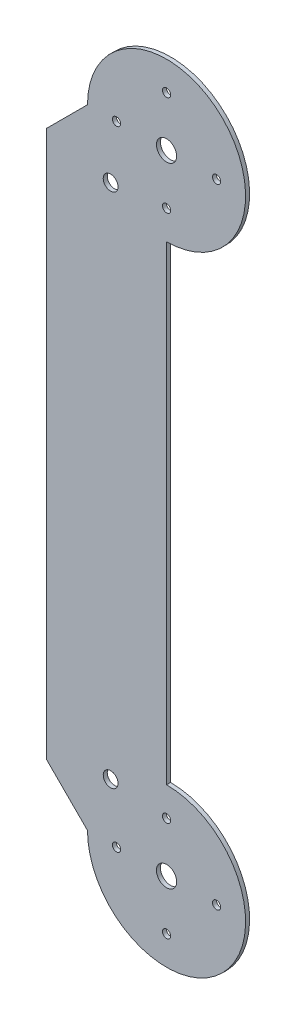
ISO-10303-21;
HEADER;
FILE_DESCRIPTION(('STEP AP214'),'2;1');
FILE_NAME('part.step','',(''),(''),'','','');
FILE_SCHEMA(('AUTOMOTIVE_DESIGN { 1 0 10303 214 1 1 1 1 }'));
ENDSEC;
DATA;
#1=APPLICATION_CONTEXT('core data for automotive mechanical design processes');
#2=APPLICATION_PROTOCOL_DEFINITION('international standard','automotive_design',2000,#1);
#3=PRODUCT_CONTEXT('',#1,'mechanical');
#4=PRODUCT('Part','Part','',(#3));
#5=PRODUCT_RELATED_PRODUCT_CATEGORY('part','',(#4));
#6=PRODUCT_DEFINITION_FORMATION('','',#4);
#7=PRODUCT_DEFINITION_CONTEXT('part definition',#1,'design');
#8=PRODUCT_DEFINITION('design','',#6,#7);
#9=PRODUCT_DEFINITION_SHAPE('','',#8);
#10=(LENGTH_UNIT() NAMED_UNIT(*) SI_UNIT(.MILLI.,.METRE.));
#11=(NAMED_UNIT(*) PLANE_ANGLE_UNIT() SI_UNIT($,.RADIAN.));
#12=(NAMED_UNIT(*) SI_UNIT($,.STERADIAN.) SOLID_ANGLE_UNIT());
#13=UNCERTAINTY_MEASURE_WITH_UNIT(LENGTH_MEASURE(1.E-05),#10,'distance_accuracy_value','');
#14=(GEOMETRIC_REPRESENTATION_CONTEXT(3) GLOBAL_UNCERTAINTY_ASSIGNED_CONTEXT((#13)) GLOBAL_UNIT_ASSIGNED_CONTEXT((#10,
#11,#12)) REPRESENTATION_CONTEXT('',''));
#15=CARTESIAN_POINT('',(0.,0.,0.));
#16=DIRECTION('',(0.,0.,1.));
#17=DIRECTION('',(1.,0.,0.));
#18=AXIS2_PLACEMENT_3D('',#15,#16,#17);
#19=CARTESIAN_POINT('',(-80.6879910513364,81.9149429056732,2.));
#20=DIRECTION('',(0.,0.,-1.));
#21=DIRECTION('',(-1.,0.,0.));
#22=AXIS2_PLACEMENT_3D('',#19,#20,#21);
#23=PLANE('',#22);
#24=CARTESIAN_POINT('',(-80.6879910513364,81.9149429056732,2.));
#25=DIRECTION('',(0.,0.,1.));
#26=DIRECTION('',(-1.,0.,0.));
#27=AXIS2_PLACEMENT_3D('',#24,#25,#26);
#28=CIRCLE('',#27,39.5);
#29=CARTESIAN_POINT('',(-80.6879910513364,42.4149429056732,2.));
#30=VERTEX_POINT('',#29);
#31=CARTESIAN_POINT('',(-120.187991051336,81.9149429056732,2.));
#32=VERTEX_POINT('',#31);
#33=EDGE_CURVE('E146',#30,#32,#28,.T.);
#34=ORIENTED_EDGE('',*,*,#33,.T.);
#35=DIRECTION('',(-0.707106781186552,-0.707106781186543,0.));
#36=VECTOR('',#35,1.);
#37=CARTESIAN_POINT('',(-120.187991051336,81.9149429056732,2.));
#38=LINE('',#37,#36);
#39=CARTESIAN_POINT('',(-140.687991051336,61.4149429056735,2.));
#40=VERTEX_POINT('',#39);
#41=EDGE_CURVE('E94',#32,#40,#38,.T.);
#42=ORIENTED_EDGE('',*,*,#41,.T.);
#43=DIRECTION('',(0.,-1.,0.));
#44=VECTOR('',#43,1.);
#45=CARTESIAN_POINT('',(-140.687991051336,-211.585057094327,2.));
#46=LINE('',#45,#44);
#47=CARTESIAN_POINT('',(-140.687991051336,-211.585057094327,2.));
#48=VERTEX_POINT('',#47);
#49=EDGE_CURVE('E107',#40,#48,#46,.T.);
#50=ORIENTED_EDGE('',*,*,#49,.T.);
#51=DIRECTION('',(0.707106781186552,-0.707106781186543,0.));
#52=VECTOR('',#51,1.);
#53=CARTESIAN_POINT('',(-120.187991051336,-232.085057094327,2.));
#54=LINE('',#53,#52);
#55=CARTESIAN_POINT('',(-120.187991051336,-232.085057094327,2.));
#56=VERTEX_POINT('',#55);
#57=EDGE_CURVE('E101',#48,#56,#54,.T.);
#58=ORIENTED_EDGE('',*,*,#57,.T.);
#59=CARTESIAN_POINT('',(-80.6879910513363,-232.085057094327,2.));
#60=DIRECTION('',(0.,0.,1.));
#61=DIRECTION('',(1.,0.,0.));
#62=AXIS2_PLACEMENT_3D('',#59,#60,#61);
#63=CIRCLE('',#62,39.5);
#64=CARTESIAN_POINT('',(-80.6879910513363,-192.585057094327,2.));
#65=VERTEX_POINT('',#64);
#66=EDGE_CURVE('E105',#56,#65,#63,.T.);
#67=ORIENTED_EDGE('',*,*,#66,.T.);
#68=DIRECTION('',(0.,1.,0.));
#69=VECTOR('',#68,1.);
#70=CARTESIAN_POINT('',(-80.6879910513364,42.4149429056732,2.));
#71=LINE('',#70,#69);
#72=EDGE_CURVE('E57',#65,#30,#71,.T.);
#73=ORIENTED_EDGE('',*,*,#72,.T.);
#74=EDGE_LOOP('',(#34,#42,#50,#58,#67,#73));
#75=FACE_BOUND('',#74,.T.);
#76=CARTESIAN_POINT('',(-80.6879910513364,56.9149429056733,2.));
#77=DIRECTION('',(0.,0.,1.));
#78=DIRECTION('',(1.,0.,0.));
#79=AXIS2_PLACEMENT_3D('',#76,#77,#78);
#80=CIRCLE('',#79,2.04999999999999);
#81=CARTESIAN_POINT('',(-78.6379910513364,56.9149429056733,2.));
#82=VERTEX_POINT('',#81);
#83=EDGE_CURVE('E134',#82,#82,#80,.T.);
#84=ORIENTED_EDGE('',*,*,#83,.F.);
#85=EDGE_LOOP('',(#84));
#86=FACE_BOUND('',#85,.T.);
#87=CARTESIAN_POINT('',(-105.687991051336,81.9149429056733,2.));
#88=DIRECTION('',(0.,0.,1.));
#89=DIRECTION('',(1.,0.,0.));
#90=AXIS2_PLACEMENT_3D('',#87,#88,#89);
#91=CIRCLE('',#90,2.04999999999998);
#92=CARTESIAN_POINT('',(-103.637991051336,81.9149429056733,2.));
#93=VERTEX_POINT('',#92);
#94=EDGE_CURVE('E314',#93,#93,#91,.T.);
#95=ORIENTED_EDGE('',*,*,#94,.F.);
#96=EDGE_LOOP('',(#95));
#97=FACE_BOUND('',#96,.T.);
#98=CARTESIAN_POINT('',(-80.6879910513364,106.914942905673,2.));
#99=DIRECTION('',(0.,0.,1.));
#100=DIRECTION('',(1.,0.,0.));
#101=AXIS2_PLACEMENT_3D('',#98,#99,#100);
#102=CIRCLE('',#101,2.04999999999998);
#103=CARTESIAN_POINT('',(-78.6379910513364,106.914942905673,2.));
#104=VERTEX_POINT('',#103);
#105=EDGE_CURVE('E306',#104,#104,#102,.T.);
#106=ORIENTED_EDGE('',*,*,#105,.F.);
#107=EDGE_LOOP('',(#106));
#108=FACE_BOUND('',#107,.T.);
#109=CARTESIAN_POINT('',(-108.618708908205,53.9842250488048,2.));
#110=DIRECTION('',(0.,0.,1.));
#111=DIRECTION('',(1.,0.,0.));
#112=AXIS2_PLACEMENT_3D('',#109,#110,#111);
#113=CIRCLE('',#112,3.70173268789992);
#114=CARTESIAN_POINT('',(-104.916976220305,53.9842250488048,2.));
#115=VERTEX_POINT('',#114);
#116=EDGE_CURVE('E298',#115,#115,#113,.T.);
#117=ORIENTED_EDGE('',*,*,#116,.F.);
#118=EDGE_LOOP('',(#117));
#119=FACE_BOUND('',#118,.T.);
#120=CARTESIAN_POINT('',(-55.6879910513364,81.9149429056732,2.));
#121=DIRECTION('',(0.,0.,1.));
#122=DIRECTION('',(1.,0.,0.));
#123=AXIS2_PLACEMENT_3D('',#120,#121,#122);
#124=CIRCLE('',#123,2.04999999999999);
#125=CARTESIAN_POINT('',(-53.6379910513364,81.9149429056732,2.));
#126=VERTEX_POINT('',#125);
#127=EDGE_CURVE('E290',#126,#126,#124,.T.);
#128=ORIENTED_EDGE('',*,*,#127,.F.);
#129=EDGE_LOOP('',(#128));
#130=FACE_BOUND('',#129,.T.);
#131=CARTESIAN_POINT('',(-80.6879910513363,-257.085057094327,2.));
#132=DIRECTION('',(0.,0.,1.));
#133=DIRECTION('',(-1.,0.,0.));
#134=AXIS2_PLACEMENT_3D('',#131,#132,#133);
#135=CIRCLE('',#134,2.05000000000002);
#136=CARTESIAN_POINT('',(-82.7379910513363,-257.085057094327,2.));
#137=VERTEX_POINT('',#136);
#138=EDGE_CURVE('E282',#137,#137,#135,.T.);
#139=ORIENTED_EDGE('',*,*,#138,.F.);
#140=EDGE_LOOP('',(#139));
#141=FACE_BOUND('',#140,.T.);
#142=CARTESIAN_POINT('',(-105.687991051336,-232.085057094327,2.));
#143=DIRECTION('',(0.,0.,1.));
#144=DIRECTION('',(-1.,0.,0.));
#145=AXIS2_PLACEMENT_3D('',#142,#143,#144);
#146=CIRCLE('',#145,2.05);
#147=CARTESIAN_POINT('',(-107.737991051336,-232.085057094327,2.));
#148=VERTEX_POINT('',#147);
#149=EDGE_CURVE('E274',#148,#148,#146,.T.);
#150=ORIENTED_EDGE('',*,*,#149,.F.);
#151=EDGE_LOOP('',(#150));
#152=FACE_BOUND('',#151,.T.);
#153=CARTESIAN_POINT('',(-55.6879910513363,-232.085057094327,2.));
#154=DIRECTION('',(0.,0.,1.));
#155=DIRECTION('',(-1.,0.,0.));
#156=AXIS2_PLACEMENT_3D('',#153,#154,#155);
#157=CIRCLE('',#156,2.04999999999999);
#158=CARTESIAN_POINT('',(-57.7379910513363,-232.085057094327,2.));
#159=VERTEX_POINT('',#158);
#160=EDGE_CURVE('E266',#159,#159,#157,.T.);
#161=ORIENTED_EDGE('',*,*,#160,.F.);
#162=EDGE_LOOP('',(#161));
#163=FACE_BOUND('',#162,.T.);
#164=CARTESIAN_POINT('',(-108.618708908205,-204.154339237458,2.));
#165=DIRECTION('',(0.,0.,1.));
#166=DIRECTION('',(-1.,0.,0.));
#167=AXIS2_PLACEMENT_3D('',#164,#165,#166);
#168=CIRCLE('',#167,3.70173268789995);
#169=CARTESIAN_POINT('',(-112.320441596105,-204.154339237458,2.));
#170=VERTEX_POINT('',#169);
#171=EDGE_CURVE('E258',#170,#170,#168,.T.);
#172=ORIENTED_EDGE('',*,*,#171,.F.);
#173=EDGE_LOOP('',(#172));
#174=FACE_BOUND('',#173,.T.);
#175=CARTESIAN_POINT('',(-80.6879910513363,-207.085057094327,2.));
#176=DIRECTION('',(0.,0.,1.));
#177=DIRECTION('',(-1.,0.,0.));
#178=AXIS2_PLACEMENT_3D('',#175,#176,#177);
#179=CIRCLE('',#178,2.04999999999999);
#180=CARTESIAN_POINT('',(-82.7379910513363,-207.085057094327,2.));
#181=VERTEX_POINT('',#180);
#182=EDGE_CURVE('E250',#181,#181,#179,.T.);
#183=ORIENTED_EDGE('',*,*,#182,.F.);
#184=EDGE_LOOP('',(#183));
#185=FACE_BOUND('',#184,.T.);
#186=CARTESIAN_POINT('',(-80.6879910513363,-232.085057094327,2.));
#187=DIRECTION('',(0.,0.,1.));
#188=DIRECTION('',(-1.,0.,0.));
#189=AXIS2_PLACEMENT_3D('',#186,#187,#188);
#190=CIRCLE('',#189,5.04999999999994);
#191=CARTESIAN_POINT('',(-85.7379910513362,-232.085057094327,2.));
#192=VERTEX_POINT('',#191);
#193=EDGE_CURVE('E242',#192,#192,#190,.T.);
#194=ORIENTED_EDGE('',*,*,#193,.F.);
#195=EDGE_LOOP('',(#194));
#196=FACE_BOUND('',#195,.T.);
#197=CARTESIAN_POINT('',(-80.6879910513363,81.9149429056732,2.));
#198=DIRECTION('',(0.,0.,1.));
#199=DIRECTION('',(1.,0.,0.));
#200=AXIS2_PLACEMENT_3D('',#197,#198,#199);
#201=CIRCLE('',#200,5.04999999999996);
#202=CARTESIAN_POINT('',(-75.6379910513364,81.9149429056732,2.));
#203=VERTEX_POINT('',#202);
#204=EDGE_CURVE('E231',#203,#203,#201,.T.);
#205=ORIENTED_EDGE('',*,*,#204,.F.);
#206=EDGE_LOOP('',(#205));
#207=FACE_BOUND('',#206,.T.);
#208=ADVANCED_FACE('F39',(#75,#86,#97,#108,#119,#130,#141,#152,#163,#174,#185,#196,#207),#23,.F.);
#209=CARTESIAN_POINT('',(-80.6879910513364,81.9149429056732,0.));
#210=DIRECTION('',(0.,0.,-1.));
#211=DIRECTION('',(-1.,0.,0.));
#212=AXIS2_PLACEMENT_3D('',#209,#210,#211);
#213=PLANE('',#212);
#214=CARTESIAN_POINT('',(-80.6879910513363,-232.085057094327,0.));
#215=DIRECTION('',(0.,0.,1.));
#216=DIRECTION('',(-1.,0.,0.));
#217=AXIS2_PLACEMENT_3D('',#214,#215,#216);
#218=CIRCLE('',#217,5.04999999999994);
#219=CARTESIAN_POINT('',(-85.7379910513362,-232.085057094327,0.));
#220=VERTEX_POINT('',#219);
#221=EDGE_CURVE('E239',#220,#220,#218,.T.);
#222=ORIENTED_EDGE('',*,*,#221,.T.);
#223=EDGE_LOOP('',(#222));
#224=FACE_BOUND('',#223,.T.);
#225=CARTESIAN_POINT('',(-108.618708908205,-204.154339237458,0.));
#226=DIRECTION('',(0.,0.,1.));
#227=DIRECTION('',(-1.,0.,0.));
#228=AXIS2_PLACEMENT_3D('',#225,#226,#227);
#229=CIRCLE('',#228,3.70173268789995);
#230=CARTESIAN_POINT('',(-112.320441596105,-204.154339237458,0.));
#231=VERTEX_POINT('',#230);
#232=EDGE_CURVE('E254',#231,#231,#229,.T.);
#233=ORIENTED_EDGE('',*,*,#232,.T.);
#234=EDGE_LOOP('',(#233));
#235=FACE_BOUND('',#234,.T.);
#236=CARTESIAN_POINT('',(-105.687991051336,-232.085057094327,0.));
#237=DIRECTION('',(0.,0.,1.));
#238=DIRECTION('',(-1.,0.,0.));
#239=AXIS2_PLACEMENT_3D('',#236,#237,#238);
#240=CIRCLE('',#239,2.05);
#241=CARTESIAN_POINT('',(-107.737991051336,-232.085057094327,0.));
#242=VERTEX_POINT('',#241);
#243=EDGE_CURVE('E270',#242,#242,#240,.T.);
#244=ORIENTED_EDGE('',*,*,#243,.T.);
#245=EDGE_LOOP('',(#244));
#246=FACE_BOUND('',#245,.T.);
#247=CARTESIAN_POINT('',(-55.6879910513364,81.9149429056732,0.));
#248=DIRECTION('',(0.,0.,1.));
#249=DIRECTION('',(1.,0.,0.));
#250=AXIS2_PLACEMENT_3D('',#247,#248,#249);
#251=CIRCLE('',#250,2.04999999999999);
#252=CARTESIAN_POINT('',(-53.6379910513364,81.9149429056732,0.));
#253=VERTEX_POINT('',#252);
#254=EDGE_CURVE('E286',#253,#253,#251,.T.);
#255=ORIENTED_EDGE('',*,*,#254,.T.);
#256=EDGE_LOOP('',(#255));
#257=FACE_BOUND('',#256,.T.);
#258=CARTESIAN_POINT('',(-80.6879910513364,106.914942905673,0.));
#259=DIRECTION('',(0.,0.,1.));
#260=DIRECTION('',(1.,0.,0.));
#261=AXIS2_PLACEMENT_3D('',#258,#259,#260);
#262=CIRCLE('',#261,2.04999999999998);
#263=CARTESIAN_POINT('',(-78.6379910513364,106.914942905673,0.));
#264=VERTEX_POINT('',#263);
#265=EDGE_CURVE('E302',#264,#264,#262,.T.);
#266=ORIENTED_EDGE('',*,*,#265,.T.);
#267=EDGE_LOOP('',(#266));
#268=FACE_BOUND('',#267,.T.);
#269=CARTESIAN_POINT('',(-80.6879910513364,56.9149429056733,0.));
#270=DIRECTION('',(0.,0.,1.));
#271=DIRECTION('',(1.,0.,0.));
#272=AXIS2_PLACEMENT_3D('',#269,#270,#271);
#273=CIRCLE('',#272,2.04999999999999);
#274=CARTESIAN_POINT('',(-78.6379910513364,56.9149429056733,0.));
#275=VERTEX_POINT('',#274);
#276=EDGE_CURVE('E318',#275,#275,#273,.T.);
#277=ORIENTED_EDGE('',*,*,#276,.T.);
#278=EDGE_LOOP('',(#277));
#279=FACE_BOUND('',#278,.T.);
#280=CARTESIAN_POINT('',(-80.6879910513364,81.9149429056732,0.));
#281=DIRECTION('',(0.,0.,1.));
#282=DIRECTION('',(-1.,0.,0.));
#283=AXIS2_PLACEMENT_3D('',#280,#281,#282);
#284=CIRCLE('',#283,39.5);
#285=CARTESIAN_POINT('',(-80.6879910513364,42.4149429056732,0.));
#286=VERTEX_POINT('',#285);
#287=CARTESIAN_POINT('',(-120.187991051336,81.9149429056732,0.));
#288=VERTEX_POINT('',#287);
#289=EDGE_CURVE('E129',#286,#288,#284,.T.);
#290=ORIENTED_EDGE('',*,*,#289,.F.);
#291=DIRECTION('',(0.,1.,0.));
#292=VECTOR('',#291,1.);
#293=CARTESIAN_POINT('',(-80.6879910513364,42.4149429056732,0.));
#294=LINE('',#293,#292);
#295=CARTESIAN_POINT('',(-80.6879910513363,-192.585057094327,0.));
#296=VERTEX_POINT('',#295);
#297=EDGE_CURVE('E86',#296,#286,#294,.T.);
#298=ORIENTED_EDGE('',*,*,#297,.F.);
#299=CARTESIAN_POINT('',(-80.6879910513363,-232.085057094327,0.));
#300=DIRECTION('',(0.,0.,1.));
#301=DIRECTION('',(1.,0.,0.));
#302=AXIS2_PLACEMENT_3D('',#299,#300,#301);
#303=CIRCLE('',#302,39.5);
#304=CARTESIAN_POINT('',(-120.187991051336,-232.085057094327,0.));
#305=VERTEX_POINT('',#304);
#306=EDGE_CURVE('E80',#305,#296,#303,.T.);
#307=ORIENTED_EDGE('',*,*,#306,.F.);
#308=DIRECTION('',(0.707106781186552,-0.707106781186543,0.));
#309=VECTOR('',#308,1.);
#310=CARTESIAN_POINT('',(-120.187991051336,-232.085057094327,0.));
#311=LINE('',#310,#309);
#312=CARTESIAN_POINT('',(-140.687991051336,-211.585057094327,0.));
#313=VERTEX_POINT('',#312);
#314=EDGE_CURVE('E116',#313,#305,#311,.T.);
#315=ORIENTED_EDGE('',*,*,#314,.F.);
#316=DIRECTION('',(0.,-1.,0.));
#317=VECTOR('',#316,1.);
#318=CARTESIAN_POINT('',(-140.687991051336,-211.585057094327,0.));
#319=LINE('',#318,#317);
#320=CARTESIAN_POINT('',(-140.687991051336,61.4149429056735,0.));
#321=VERTEX_POINT('',#320);
#322=EDGE_CURVE('E137',#321,#313,#319,.T.);
#323=ORIENTED_EDGE('',*,*,#322,.F.);
#324=DIRECTION('',(-0.707106781186552,-0.707106781186543,0.));
#325=VECTOR('',#324,1.);
#326=CARTESIAN_POINT('',(-120.187991051336,81.9149429056732,0.));
#327=LINE('',#326,#325);
#328=EDGE_CURVE('E133',#288,#321,#327,.T.);
#329=ORIENTED_EDGE('',*,*,#328,.F.);
#330=EDGE_LOOP('',(#290,#298,#307,#315,#323,#329));
#331=FACE_BOUND('',#330,.T.);
#332=CARTESIAN_POINT('',(-105.687991051336,81.9149429056733,0.));
#333=DIRECTION('',(0.,0.,1.));
#334=DIRECTION('',(1.,0.,0.));
#335=AXIS2_PLACEMENT_3D('',#332,#333,#334);
#336=CIRCLE('',#335,2.04999999999998);
#337=CARTESIAN_POINT('',(-103.637991051336,81.9149429056733,0.));
#338=VERTEX_POINT('',#337);
#339=EDGE_CURVE('E310',#338,#338,#336,.T.);
#340=ORIENTED_EDGE('',*,*,#339,.T.);
#341=EDGE_LOOP('',(#340));
#342=FACE_BOUND('',#341,.T.);
#343=CARTESIAN_POINT('',(-108.618708908205,53.9842250488048,0.));
#344=DIRECTION('',(0.,0.,1.));
#345=DIRECTION('',(1.,0.,0.));
#346=AXIS2_PLACEMENT_3D('',#343,#344,#345);
#347=CIRCLE('',#346,3.70173268789992);
#348=CARTESIAN_POINT('',(-104.916976220305,53.9842250488048,0.));
#349=VERTEX_POINT('',#348);
#350=EDGE_CURVE('E294',#349,#349,#347,.T.);
#351=ORIENTED_EDGE('',*,*,#350,.T.);
#352=EDGE_LOOP('',(#351));
#353=FACE_BOUND('',#352,.T.);
#354=CARTESIAN_POINT('',(-80.6879910513363,-257.085057094327,0.));
#355=DIRECTION('',(0.,0.,1.));
#356=DIRECTION('',(-1.,0.,0.));
#357=AXIS2_PLACEMENT_3D('',#354,#355,#356);
#358=CIRCLE('',#357,2.05000000000002);
#359=CARTESIAN_POINT('',(-82.7379910513363,-257.085057094327,0.));
#360=VERTEX_POINT('',#359);
#361=EDGE_CURVE('E278',#360,#360,#358,.T.);
#362=ORIENTED_EDGE('',*,*,#361,.T.);
#363=EDGE_LOOP('',(#362));
#364=FACE_BOUND('',#363,.T.);
#365=CARTESIAN_POINT('',(-55.6879910513363,-232.085057094327,0.));
#366=DIRECTION('',(0.,0.,1.));
#367=DIRECTION('',(-1.,0.,0.));
#368=AXIS2_PLACEMENT_3D('',#365,#366,#367);
#369=CIRCLE('',#368,2.04999999999999);
#370=CARTESIAN_POINT('',(-57.7379910513363,-232.085057094327,0.));
#371=VERTEX_POINT('',#370);
#372=EDGE_CURVE('E262',#371,#371,#369,.T.);
#373=ORIENTED_EDGE('',*,*,#372,.T.);
#374=EDGE_LOOP('',(#373));
#375=FACE_BOUND('',#374,.T.);
#376=CARTESIAN_POINT('',(-80.6879910513363,-207.085057094327,0.));
#377=DIRECTION('',(0.,0.,1.));
#378=DIRECTION('',(-1.,0.,0.));
#379=AXIS2_PLACEMENT_3D('',#376,#377,#378);
#380=CIRCLE('',#379,2.04999999999999);
#381=CARTESIAN_POINT('',(-82.7379910513363,-207.085057094327,0.));
#382=VERTEX_POINT('',#381);
#383=EDGE_CURVE('E246',#382,#382,#380,.T.);
#384=ORIENTED_EDGE('',*,*,#383,.T.);
#385=EDGE_LOOP('',(#384));
#386=FACE_BOUND('',#385,.T.);
#387=CARTESIAN_POINT('',(-80.6879910513363,81.9149429056732,0.));
#388=DIRECTION('',(0.,0.,1.));
#389=DIRECTION('',(1.,0.,0.));
#390=AXIS2_PLACEMENT_3D('',#387,#388,#389);
#391=CIRCLE('',#390,5.04999999999996);
#392=CARTESIAN_POINT('',(-75.6379910513364,81.9149429056732,0.));
#393=VERTEX_POINT('',#392);
#394=EDGE_CURVE('E234',#393,#393,#391,.T.);
#395=ORIENTED_EDGE('',*,*,#394,.T.);
#396=EDGE_LOOP('',(#395));
#397=FACE_BOUND('',#396,.T.);
#398=ADVANCED_FACE('F159',(#224,#235,#246,#257,#268,#279,#331,#342,#353,#364,#375,#386,#397),
#213,.T.);
#399=CARTESIAN_POINT('',(-80.6879910513364,81.9149429056732,2.));
#400=DIRECTION('',(0.,0.,-1.));
#401=DIRECTION('',(-1.,0.,0.));
#402=AXIS2_PLACEMENT_3D('',#399,#400,#401);
#403=CYLINDRICAL_SURFACE('',#402,39.5);
#404=ORIENTED_EDGE('',*,*,#289,.T.);
#405=DIRECTION('',(0.,0.,-1.));
#406=VECTOR('',#405,1.);
#407=CARTESIAN_POINT('',(-120.187991051336,81.9149429056732,2.));
#408=LINE('',#407,#406);
#409=EDGE_CURVE('E11',#32,#288,#408,.T.);
#410=ORIENTED_EDGE('',*,*,#409,.F.);
#411=ORIENTED_EDGE('',*,*,#33,.F.);
#412=DIRECTION('',(0.,0.,-1.));
#413=VECTOR('',#412,1.);
#414=CARTESIAN_POINT('',(-80.6879910513364,42.4149429056732,2.));
#415=LINE('',#414,#413);
#416=EDGE_CURVE('E125',#30,#286,#415,.T.);
#417=ORIENTED_EDGE('',*,*,#416,.T.);
#418=EDGE_LOOP('',(#404,#410,#411,#417));
#419=FACE_BOUND('',#418,.T.);
#420=ADVANCED_FACE('F41',(#419),#403,.T.);
#421=CARTESIAN_POINT('',(-120.187991051336,81.9149429056732,2.));
#422=DIRECTION('',(0.707106781186543,-0.707106781186552,0.));
#423=DIRECTION('',(0.707106781186552,0.707106781186543,0.));
#424=AXIS2_PLACEMENT_3D('',#421,#422,#423);
#425=PLANE('',#424);
#426=ORIENTED_EDGE('',*,*,#328,.T.);
#427=DIRECTION('',(0.,0.,-1.));
#428=VECTOR('',#427,1.);
#429=CARTESIAN_POINT('',(-140.687991051336,61.4149429056735,2.));
#430=LINE('',#429,#428);
#431=EDGE_CURVE('E49',#40,#321,#430,.T.);
#432=ORIENTED_EDGE('',*,*,#431,.F.);
#433=ORIENTED_EDGE('',*,*,#41,.F.);
#434=ORIENTED_EDGE('',*,*,#409,.T.);
#435=EDGE_LOOP('',(#426,#432,#433,#434));
#436=FACE_BOUND('',#435,.T.);
#437=ADVANCED_FACE('F456',(#436),#425,.F.);
#438=CARTESIAN_POINT('',(-140.687991051336,-211.585057094327,2.));
#439=DIRECTION('',(1.,0.,0.));
#440=DIRECTION('',(0.,1.,0.));
#441=AXIS2_PLACEMENT_3D('',#438,#439,#440);
#442=PLANE('',#441);
#443=ORIENTED_EDGE('',*,*,#322,.T.);
#444=DIRECTION('',(0.,0.,-1.));
#445=VECTOR('',#444,1.);
#446=CARTESIAN_POINT('',(-140.687991051336,-211.585057094327,2.));
#447=LINE('',#446,#445);
#448=EDGE_CURVE('E118',#48,#313,#447,.T.);
#449=ORIENTED_EDGE('',*,*,#448,.F.);
#450=ORIENTED_EDGE('',*,*,#49,.F.);
#451=ORIENTED_EDGE('',*,*,#431,.T.);
#452=EDGE_LOOP('',(#443,#449,#450,#451));
#453=FACE_BOUND('',#452,.T.);
#454=ADVANCED_FACE('F156',(#453),#442,.F.);
#455=CARTESIAN_POINT('',(-120.187991051336,-232.085057094327,2.));
#456=DIRECTION('',(0.707106781186543,0.707106781186552,0.));
#457=DIRECTION('',(-0.707106781186552,0.707106781186543,0.));
#458=AXIS2_PLACEMENT_3D('',#455,#456,#457);
#459=PLANE('',#458);
#460=ORIENTED_EDGE('',*,*,#314,.T.);
#461=DIRECTION('',(0.,0.,-1.));
#462=VECTOR('',#461,1.);
#463=CARTESIAN_POINT('',(-120.187991051336,-232.085057094327,2.));
#464=LINE('',#463,#462);
#465=EDGE_CURVE('E113',#56,#305,#464,.T.);
#466=ORIENTED_EDGE('',*,*,#465,.F.);
#467=ORIENTED_EDGE('',*,*,#57,.F.);
#468=ORIENTED_EDGE('',*,*,#448,.T.);
#469=EDGE_LOOP('',(#460,#466,#467,#468));
#470=FACE_BOUND('',#469,.T.);
#471=ADVANCED_FACE('F114',(#470),#459,.F.);
#472=CARTESIAN_POINT('',(-80.6879910513363,-232.085057094327,2.));
#473=DIRECTION('',(0.,0.,-1.));
#474=DIRECTION('',(-1.,0.,0.));
#475=AXIS2_PLACEMENT_3D('',#472,#473,#474);
#476=CYLINDRICAL_SURFACE('',#475,39.5);
#477=ORIENTED_EDGE('',*,*,#306,.T.);
#478=DIRECTION('',(0.,0.,-1.));
#479=VECTOR('',#478,1.);
#480=CARTESIAN_POINT('',(-80.6879910513363,-192.585057094327,2.));
#481=LINE('',#480,#479);
#482=EDGE_CURVE('E119',#65,#296,#481,.T.);
#483=ORIENTED_EDGE('',*,*,#482,.F.);
#484=ORIENTED_EDGE('',*,*,#66,.F.);
#485=ORIENTED_EDGE('',*,*,#465,.T.);
#486=EDGE_LOOP('',(#477,#483,#484,#485));
#487=FACE_BOUND('',#486,.T.);
#488=ADVANCED_FACE('F121',(#487),#476,.T.);
#489=CARTESIAN_POINT('',(-80.6879910513364,42.4149429056732,2.));
#490=DIRECTION('',(-1.,0.,0.));
#491=DIRECTION('',(0.,-1.,0.));
#492=AXIS2_PLACEMENT_3D('',#489,#490,#491);
#493=PLANE('',#492);
#494=ORIENTED_EDGE('',*,*,#297,.T.);
#495=ORIENTED_EDGE('',*,*,#416,.F.);
#496=ORIENTED_EDGE('',*,*,#72,.F.);
#497=ORIENTED_EDGE('',*,*,#482,.T.);
#498=EDGE_LOOP('',(#494,#495,#496,#497));
#499=FACE_BOUND('',#498,.T.);
#500=ADVANCED_FACE('F164',(#499),#493,.F.);
#501=CARTESIAN_POINT('',(-80.6879910513364,56.9149429056733,2.));
#502=DIRECTION('',(0.,0.,-1.));
#503=DIRECTION('',(-1.,0.,0.));
#504=AXIS2_PLACEMENT_3D('',#501,#502,#503);
#505=CYLINDRICAL_SURFACE('',#504,2.04999999999999);
#506=ORIENTED_EDGE('',*,*,#83,.T.);
#507=EDGE_LOOP('',(#506));
#508=FACE_BOUND('',#507,.T.);
#509=ORIENTED_EDGE('',*,*,#276,.F.);
#510=EDGE_LOOP('',(#509));
#511=FACE_BOUND('',#510,.T.);
#512=ADVANCED_FACE('F166',(#508,#511),#505,.F.);
#513=CARTESIAN_POINT('',(-105.687991051336,81.9149429056733,2.));
#514=DIRECTION('',(0.,0.,-1.));
#515=DIRECTION('',(-1.,0.,0.));
#516=AXIS2_PLACEMENT_3D('',#513,#514,#515);
#517=CYLINDRICAL_SURFACE('',#516,2.04999999999998);
#518=ORIENTED_EDGE('',*,*,#94,.T.);
#519=EDGE_LOOP('',(#518));
#520=FACE_BOUND('',#519,.T.);
#521=ORIENTED_EDGE('',*,*,#339,.F.);
#522=EDGE_LOOP('',(#521));
#523=FACE_BOUND('',#522,.T.);
#524=ADVANCED_FACE('F172',(#520,#523),#517,.F.);
#525=CARTESIAN_POINT('',(-80.6879910513364,106.914942905673,2.));
#526=DIRECTION('',(0.,0.,-1.));
#527=DIRECTION('',(-1.,0.,0.));
#528=AXIS2_PLACEMENT_3D('',#525,#526,#527);
#529=CYLINDRICAL_SURFACE('',#528,2.04999999999998);
#530=ORIENTED_EDGE('',*,*,#105,.T.);
#531=EDGE_LOOP('',(#530));
#532=FACE_BOUND('',#531,.T.);
#533=ORIENTED_EDGE('',*,*,#265,.F.);
#534=EDGE_LOOP('',(#533));
#535=FACE_BOUND('',#534,.T.);
#536=ADVANCED_FACE('F186',(#532,#535),#529,.F.);
#537=CARTESIAN_POINT('',(-108.618708908205,53.9842250488048,2.));
#538=DIRECTION('',(0.,0.,-1.));
#539=DIRECTION('',(-1.,0.,0.));
#540=AXIS2_PLACEMENT_3D('',#537,#538,#539);
#541=CYLINDRICAL_SURFACE('',#540,3.70173268789992);
#542=ORIENTED_EDGE('',*,*,#116,.T.);
#543=EDGE_LOOP('',(#542));
#544=FACE_BOUND('',#543,.T.);
#545=ORIENTED_EDGE('',*,*,#350,.F.);
#546=EDGE_LOOP('',(#545));
#547=FACE_BOUND('',#546,.T.);
#548=ADVANCED_FACE('F190',(#544,#547),#541,.F.);
#549=CARTESIAN_POINT('',(-55.6879910513364,81.9149429056732,2.));
#550=DIRECTION('',(0.,0.,-1.));
#551=DIRECTION('',(-1.,0.,0.));
#552=AXIS2_PLACEMENT_3D('',#549,#550,#551);
#553=CYLINDRICAL_SURFACE('',#552,2.04999999999999);
#554=ORIENTED_EDGE('',*,*,#127,.T.);
#555=EDGE_LOOP('',(#554));
#556=FACE_BOUND('',#555,.T.);
#557=ORIENTED_EDGE('',*,*,#254,.F.);
#558=EDGE_LOOP('',(#557));
#559=FACE_BOUND('',#558,.T.);
#560=ADVANCED_FACE('F194',(#556,#559),#553,.F.);
#561=CARTESIAN_POINT('',(-80.6879910513363,-257.085057094327,2.));
#562=DIRECTION('',(0.,0.,-1.));
#563=DIRECTION('',(-1.,0.,0.));
#564=AXIS2_PLACEMENT_3D('',#561,#562,#563);
#565=CYLINDRICAL_SURFACE('',#564,2.05000000000002);
#566=ORIENTED_EDGE('',*,*,#138,.T.);
#567=EDGE_LOOP('',(#566));
#568=FACE_BOUND('',#567,.T.);
#569=ORIENTED_EDGE('',*,*,#361,.F.);
#570=EDGE_LOOP('',(#569));
#571=FACE_BOUND('',#570,.T.);
#572=ADVANCED_FACE('F198',(#568,#571),#565,.F.);
#573=CARTESIAN_POINT('',(-105.687991051336,-232.085057094327,2.));
#574=DIRECTION('',(0.,0.,-1.));
#575=DIRECTION('',(-1.,0.,0.));
#576=AXIS2_PLACEMENT_3D('',#573,#574,#575);
#577=CYLINDRICAL_SURFACE('',#576,2.05);
#578=ORIENTED_EDGE('',*,*,#149,.T.);
#579=EDGE_LOOP('',(#578));
#580=FACE_BOUND('',#579,.T.);
#581=ORIENTED_EDGE('',*,*,#243,.F.);
#582=EDGE_LOOP('',(#581));
#583=FACE_BOUND('',#582,.T.);
#584=ADVANCED_FACE('F202',(#580,#583),#577,.F.);
#585=CARTESIAN_POINT('',(-55.6879910513363,-232.085057094327,2.));
#586=DIRECTION('',(0.,0.,-1.));
#587=DIRECTION('',(-1.,0.,0.));
#588=AXIS2_PLACEMENT_3D('',#585,#586,#587);
#589=CYLINDRICAL_SURFACE('',#588,2.04999999999999);
#590=ORIENTED_EDGE('',*,*,#160,.T.);
#591=EDGE_LOOP('',(#590));
#592=FACE_BOUND('',#591,.T.);
#593=ORIENTED_EDGE('',*,*,#372,.F.);
#594=EDGE_LOOP('',(#593));
#595=FACE_BOUND('',#594,.T.);
#596=ADVANCED_FACE('F206',(#592,#595),#589,.F.);
#597=CARTESIAN_POINT('',(-108.618708908205,-204.154339237458,2.));
#598=DIRECTION('',(0.,0.,-1.));
#599=DIRECTION('',(-1.,0.,0.));
#600=AXIS2_PLACEMENT_3D('',#597,#598,#599);
#601=CYLINDRICAL_SURFACE('',#600,3.70173268789995);
#602=ORIENTED_EDGE('',*,*,#171,.T.);
#603=EDGE_LOOP('',(#602));
#604=FACE_BOUND('',#603,.T.);
#605=ORIENTED_EDGE('',*,*,#232,.F.);
#606=EDGE_LOOP('',(#605));
#607=FACE_BOUND('',#606,.T.);
#608=ADVANCED_FACE('F210',(#604,#607),#601,.F.);
#609=CARTESIAN_POINT('',(-80.6879910513363,-207.085057094327,2.));
#610=DIRECTION('',(0.,0.,-1.));
#611=DIRECTION('',(-1.,0.,0.));
#612=AXIS2_PLACEMENT_3D('',#609,#610,#611);
#613=CYLINDRICAL_SURFACE('',#612,2.04999999999999);
#614=ORIENTED_EDGE('',*,*,#182,.T.);
#615=EDGE_LOOP('',(#614));
#616=FACE_BOUND('',#615,.T.);
#617=ORIENTED_EDGE('',*,*,#383,.F.);
#618=EDGE_LOOP('',(#617));
#619=FACE_BOUND('',#618,.T.);
#620=ADVANCED_FACE('F214',(#616,#619),#613,.F.);
#621=CARTESIAN_POINT('',(-80.6879910513363,-232.085057094327,2.));
#622=DIRECTION('',(0.,0.,-1.));
#623=DIRECTION('',(-1.,0.,0.));
#624=AXIS2_PLACEMENT_3D('',#621,#622,#623);
#625=CYLINDRICAL_SURFACE('',#624,5.04999999999994);
#626=ORIENTED_EDGE('',*,*,#193,.T.);
#627=EDGE_LOOP('',(#626));
#628=FACE_BOUND('',#627,.T.);
#629=ORIENTED_EDGE('',*,*,#221,.F.);
#630=EDGE_LOOP('',(#629));
#631=FACE_BOUND('',#630,.T.);
#632=ADVANCED_FACE('F218',(#628,#631),#625,.F.);
#633=CARTESIAN_POINT('',(-80.6879910513363,81.9149429056732,2.));
#634=DIRECTION('',(0.,0.,-1.));
#635=DIRECTION('',(-1.,0.,0.));
#636=AXIS2_PLACEMENT_3D('',#633,#634,#635);
#637=CYLINDRICAL_SURFACE('',#636,5.04999999999996);
#638=ORIENTED_EDGE('',*,*,#204,.T.);
#639=EDGE_LOOP('',(#638));
#640=FACE_BOUND('',#639,.T.);
#641=ORIENTED_EDGE('',*,*,#394,.F.);
#642=EDGE_LOOP('',(#641));
#643=FACE_BOUND('',#642,.T.);
#644=ADVANCED_FACE('F222',(#640,#643),#637,.F.);
#645=CLOSED_SHELL('',(#208,#398,#420,#437,#454,#471,#488,#500,#512,#524,#536,#548,#560,#572,
#584,#596,#608,#620,#632,#644));
#646=MANIFOLD_SOLID_BREP('B2',#645);
#647=ADVANCED_BREP_SHAPE_REPRESENTATION('',(#18,#646),#14);
#648=SHAPE_DEFINITION_REPRESENTATION(#9,#647);
ENDSEC;
END-ISO-10303-21;
